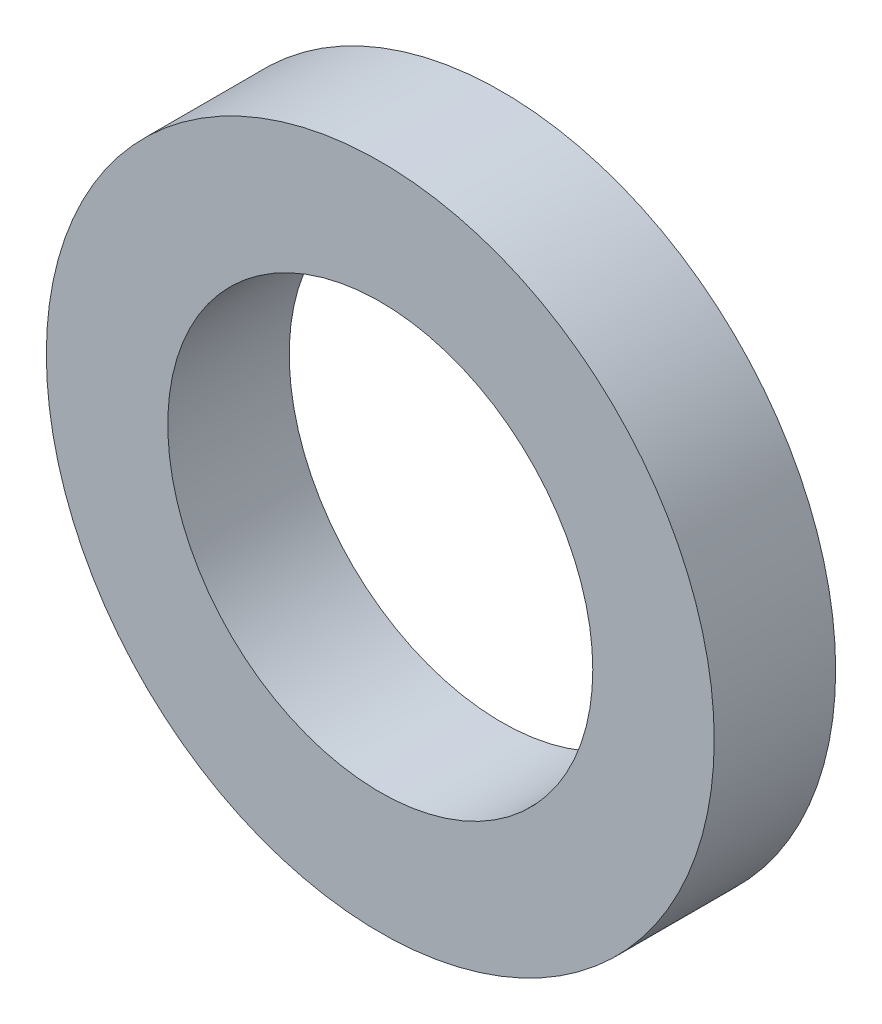
ISO-10303-21;
HEADER;
FILE_DESCRIPTION(('STEP AP214'),'2;1');
FILE_NAME('part.step','',(''),(''),'','','');
FILE_SCHEMA(('AUTOMOTIVE_DESIGN { 1 0 10303 214 1 1 1 1 }'));
ENDSEC;
DATA;
#1=APPLICATION_CONTEXT('core data for automotive mechanical design processes');
#2=APPLICATION_PROTOCOL_DEFINITION('international standard','automotive_design',2000,#1);
#3=PRODUCT_CONTEXT('',#1,'mechanical');
#4=PRODUCT('Part','Part','',(#3));
#5=PRODUCT_RELATED_PRODUCT_CATEGORY('part','',(#4));
#6=PRODUCT_DEFINITION_FORMATION('','',#4);
#7=PRODUCT_DEFINITION_CONTEXT('part definition',#1,'design');
#8=PRODUCT_DEFINITION('design','',#6,#7);
#9=PRODUCT_DEFINITION_SHAPE('','',#8);
#10=(LENGTH_UNIT() NAMED_UNIT(*) SI_UNIT(.MILLI.,.METRE.));
#11=(NAMED_UNIT(*) PLANE_ANGLE_UNIT() SI_UNIT($,.RADIAN.));
#12=(NAMED_UNIT(*) SI_UNIT($,.STERADIAN.) SOLID_ANGLE_UNIT());
#13=UNCERTAINTY_MEASURE_WITH_UNIT(LENGTH_MEASURE(1.E-05),#10,'distance_accuracy_value','');
#14=(GEOMETRIC_REPRESENTATION_CONTEXT(3) GLOBAL_UNCERTAINTY_ASSIGNED_CONTEXT((#13)) GLOBAL_UNIT_ASSIGNED_CONTEXT((#10,
#11,#12)) REPRESENTATION_CONTEXT('',''));
#15=CARTESIAN_POINT('',(0.,0.,0.));
#16=DIRECTION('',(0.,0.,1.));
#17=DIRECTION('',(1.,0.,0.));
#18=AXIS2_PLACEMENT_3D('',#15,#16,#17);
#19=CARTESIAN_POINT('',(0.,0.,12.7));
#20=DIRECTION('',(0.,0.,1.));
#21=DIRECTION('',(1.,0.,0.));
#22=AXIS2_PLACEMENT_3D('',#19,#20,#21);
#23=PLANE('',#22);
#24=CARTESIAN_POINT('',(0.,0.,12.7));
#25=DIRECTION('',(0.,0.,1.));
#26=DIRECTION('',(1.,0.,0.));
#27=AXIS2_PLACEMENT_3D('',#24,#25,#26);
#28=CIRCLE('',#27,34.925);
#29=CARTESIAN_POINT('',(34.925,0.,12.7));
#30=VERTEX_POINT('',#29);
#31=EDGE_CURVE('E10',#30,#30,#28,.T.);
#32=ORIENTED_EDGE('',*,*,#31,.T.);
#33=EDGE_LOOP('',(#32));
#34=FACE_BOUND('',#33,.T.);
#35=CARTESIAN_POINT('',(0.,0.,12.7));
#36=DIRECTION('',(0.,0.,1.));
#37=DIRECTION('',(1.,0.,0.));
#38=AXIS2_PLACEMENT_3D('',#35,#36,#37);
#39=CIRCLE('',#38,22.225);
#40=CARTESIAN_POINT('',(22.225,0.,12.7));
#41=VERTEX_POINT('',#40);
#42=EDGE_CURVE('E50',#41,#41,#39,.T.);
#43=ORIENTED_EDGE('',*,*,#42,.F.);
#44=EDGE_LOOP('',(#43));
#45=FACE_BOUND('',#44,.T.);
#46=ADVANCED_FACE('F37',(#34,#45),#23,.T.);
#47=CARTESIAN_POINT('',(0.,0.,0.));
#48=DIRECTION('',(0.,0.,1.));
#49=DIRECTION('',(1.,0.,0.));
#50=AXIS2_PLACEMENT_3D('',#47,#48,#49);
#51=PLANE('',#50);
#52=CARTESIAN_POINT('',(0.,0.,0.));
#53=DIRECTION('',(0.,0.,1.));
#54=DIRECTION('',(1.,0.,0.));
#55=AXIS2_PLACEMENT_3D('',#52,#53,#54);
#56=CIRCLE('',#55,34.925);
#57=CARTESIAN_POINT('',(34.925,0.,0.));
#58=VERTEX_POINT('',#57);
#59=EDGE_CURVE('E41',#58,#58,#56,.T.);
#60=ORIENTED_EDGE('',*,*,#59,.F.);
#61=EDGE_LOOP('',(#60));
#62=FACE_BOUND('',#61,.T.);
#63=CARTESIAN_POINT('',(0.,0.,0.));
#64=DIRECTION('',(0.,0.,1.));
#65=DIRECTION('',(1.,0.,0.));
#66=AXIS2_PLACEMENT_3D('',#63,#64,#65);
#67=CIRCLE('',#66,22.225);
#68=CARTESIAN_POINT('',(22.225,0.,0.));
#69=VERTEX_POINT('',#68);
#70=EDGE_CURVE('E52',#69,#69,#67,.T.);
#71=ORIENTED_EDGE('',*,*,#70,.T.);
#72=EDGE_LOOP('',(#71));
#73=FACE_BOUND('',#72,.T.);
#74=ADVANCED_FACE('F64',(#62,#73),#51,.F.);
#75=CARTESIAN_POINT('',(0.,0.,12.7));
#76=DIRECTION('',(0.,0.,-1.));
#77=DIRECTION('',(-1.,0.,0.));
#78=AXIS2_PLACEMENT_3D('',#75,#76,#77);
#79=CYLINDRICAL_SURFACE('',#78,34.925);
#80=ORIENTED_EDGE('',*,*,#31,.F.);
#81=EDGE_LOOP('',(#80));
#82=FACE_BOUND('',#81,.T.);
#83=ORIENTED_EDGE('',*,*,#59,.T.);
#84=EDGE_LOOP('',(#83));
#85=FACE_BOUND('',#84,.T.);
#86=ADVANCED_FACE('F39',(#82,#85),#79,.T.);
#87=CARTESIAN_POINT('',(0.,0.,12.7));
#88=DIRECTION('',(0.,0.,-1.));
#89=DIRECTION('',(-1.,0.,0.));
#90=AXIS2_PLACEMENT_3D('',#87,#88,#89);
#91=CYLINDRICAL_SURFACE('',#90,22.225);
#92=ORIENTED_EDGE('',*,*,#42,.T.);
#93=EDGE_LOOP('',(#92));
#94=FACE_BOUND('',#93,.T.);
#95=ORIENTED_EDGE('',*,*,#70,.F.);
#96=EDGE_LOOP('',(#95));
#97=FACE_BOUND('',#96,.T.);
#98=ADVANCED_FACE('F60',(#94,#97),#91,.F.);
#99=CLOSED_SHELL('',(#46,#74,#86,#98));
#100=MANIFOLD_SOLID_BREP('B2',#99);
#101=ADVANCED_BREP_SHAPE_REPRESENTATION('',(#18,#100),#14);
#102=SHAPE_DEFINITION_REPRESENTATION(#9,#101);
ENDSEC;
END-ISO-10303-21;
